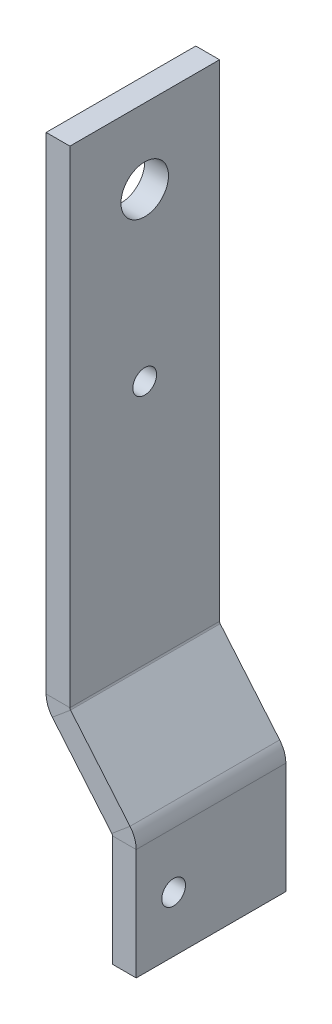
ISO-10303-21;
HEADER;
FILE_DESCRIPTION(('STEP AP214'),'2;1');
FILE_NAME('part.step','',(''),(''),'','','');
FILE_SCHEMA(('AUTOMOTIVE_DESIGN { 1 0 10303 214 1 1 1 1 }'));
ENDSEC;
DATA;
#1=APPLICATION_CONTEXT('core data for automotive mechanical design processes');
#2=APPLICATION_PROTOCOL_DEFINITION('international standard','automotive_design',2000,#1);
#3=PRODUCT_CONTEXT('',#1,'mechanical');
#4=PRODUCT('Part','Part','',(#3));
#5=PRODUCT_RELATED_PRODUCT_CATEGORY('part','',(#4));
#6=PRODUCT_DEFINITION_FORMATION('','',#4);
#7=PRODUCT_DEFINITION_CONTEXT('part definition',#1,'design');
#8=PRODUCT_DEFINITION('design','',#6,#7);
#9=PRODUCT_DEFINITION_SHAPE('','',#8);
#10=(LENGTH_UNIT() NAMED_UNIT(*) SI_UNIT(.MILLI.,.METRE.));
#11=(NAMED_UNIT(*) PLANE_ANGLE_UNIT() SI_UNIT($,.RADIAN.));
#12=(NAMED_UNIT(*) SI_UNIT($,.STERADIAN.) SOLID_ANGLE_UNIT());
#13=UNCERTAINTY_MEASURE_WITH_UNIT(LENGTH_MEASURE(1.E-05),#10,'distance_accuracy_value','');
#14=(GEOMETRIC_REPRESENTATION_CONTEXT(3) GLOBAL_UNCERTAINTY_ASSIGNED_CONTEXT((#13)) GLOBAL_UNIT_ASSIGNED_CONTEXT((#10,
#11,#12)) REPRESENTATION_CONTEXT('',''));
#15=CARTESIAN_POINT('',(0.,0.,0.));
#16=DIRECTION('',(0.,0.,1.));
#17=DIRECTION('',(1.,0.,0.));
#18=AXIS2_PLACEMENT_3D('',#15,#16,#17);
#19=CARTESIAN_POINT('',(-6.35,-130.,0.));
#20=DIRECTION('',(0.,0.,1.));
#21=DIRECTION('',(1.,0.,0.));
#22=AXIS2_PLACEMENT_3D('',#19,#20,#21);
#23=PLANE('',#22);
#24=DIRECTION('',(0.,-1.,0.));
#25=VECTOR('',#24,1.);
#26=CARTESIAN_POINT('',(0.,-130.,0.));
#27=LINE('',#26,#25);
#28=CARTESIAN_POINT('',(0.,0.,0.));
#29=VERTEX_POINT('',#28);
#30=CARTESIAN_POINT('',(0.,-130.,0.));
#31=VERTEX_POINT('',#30);
#32=EDGE_CURVE('E284',#29,#31,#27,.T.);
#33=ORIENTED_EDGE('',*,*,#32,.F.);
#34=DIRECTION('',(1.,0.,0.));
#35=VECTOR('',#34,1.);
#36=CARTESIAN_POINT('',(-6.35,0.,0.));
#37=LINE('',#36,#35);
#38=CARTESIAN_POINT('',(-6.35,0.,0.));
#39=VERTEX_POINT('',#38);
#40=EDGE_CURVE('E13',#39,#29,#37,.T.);
#41=ORIENTED_EDGE('',*,*,#40,.F.);
#42=DIRECTION('',(0.,-1.,0.));
#43=VECTOR('',#42,1.);
#44=CARTESIAN_POINT('',(-6.35,-130.,0.));
#45=LINE('',#44,#43);
#46=CARTESIAN_POINT('',(-6.35,-130.,0.));
#47=VERTEX_POINT('',#46);
#48=EDGE_CURVE('E287',#39,#47,#45,.T.);
#49=ORIENTED_EDGE('',*,*,#48,.T.);
#50=DIRECTION('',(1.,0.,0.));
#51=VECTOR('',#50,1.);
#52=CARTESIAN_POINT('',(-6.35,-130.,0.));
#53=LINE('',#52,#51);
#54=EDGE_CURVE('E86',#47,#31,#53,.T.);
#55=ORIENTED_EDGE('',*,*,#54,.T.);
#56=EDGE_LOOP('',(#33,#41,#49,#55));
#57=FACE_BOUND('',#56,.T.);
#58=ADVANCED_FACE('F83',(#57),#23,.T.);
#59=CARTESIAN_POINT('',(-6.35,0.,0.));
#60=DIRECTION('',(0.,1.,0.));
#61=DIRECTION('',(0.,0.,1.));
#62=AXIS2_PLACEMENT_3D('',#59,#60,#61);
#63=PLANE('',#62);
#64=DIRECTION('',(0.,0.,1.));
#65=VECTOR('',#64,1.);
#66=CARTESIAN_POINT('',(0.,0.,0.));
#67=LINE('',#66,#65);
#68=CARTESIAN_POINT('',(0.,0.,-40.));
#69=VERTEX_POINT('',#68);
#70=EDGE_CURVE('E289',#69,#29,#67,.T.);
#71=ORIENTED_EDGE('',*,*,#70,.F.);
#72=DIRECTION('',(1.,0.,0.));
#73=VECTOR('',#72,1.);
#74=CARTESIAN_POINT('',(-6.35,0.,-40.));
#75=LINE('',#74,#73);
#76=CARTESIAN_POINT('',(-6.35,0.,-40.));
#77=VERTEX_POINT('',#76);
#78=EDGE_CURVE('E92',#77,#69,#75,.T.);
#79=ORIENTED_EDGE('',*,*,#78,.F.);
#80=DIRECTION('',(0.,0.,1.));
#81=VECTOR('',#80,1.);
#82=CARTESIAN_POINT('',(-6.35,0.,0.));
#83=LINE('',#82,#81);
#84=EDGE_CURVE('E293',#77,#39,#83,.T.);
#85=ORIENTED_EDGE('',*,*,#84,.T.);
#86=ORIENTED_EDGE('',*,*,#40,.T.);
#87=EDGE_LOOP('',(#71,#79,#85,#86));
#88=FACE_BOUND('',#87,.T.);
#89=ADVANCED_FACE('F368',(#88),#63,.T.);
#90=CARTESIAN_POINT('',(-6.35,0.,-40.));
#91=DIRECTION('',(0.,0.,-1.));
#92=DIRECTION('',(0.,1.,0.));
#93=AXIS2_PLACEMENT_3D('',#90,#91,#92);
#94=PLANE('',#93);
#95=DIRECTION('',(0.,1.,0.));
#96=VECTOR('',#95,1.);
#97=CARTESIAN_POINT('',(0.,0.,-40.));
#98=LINE('',#97,#96);
#99=CARTESIAN_POINT('',(0.,-130.,-40.));
#100=VERTEX_POINT('',#99);
#101=EDGE_CURVE('E300',#100,#69,#98,.T.);
#102=ORIENTED_EDGE('',*,*,#101,.F.);
#103=DIRECTION('',(1.,0.,0.));
#104=VECTOR('',#103,1.);
#105=CARTESIAN_POINT('',(-6.35,-130.,-40.));
#106=LINE('',#105,#104);
#107=CARTESIAN_POINT('',(-6.35,-130.,-40.));
#108=VERTEX_POINT('',#107);
#109=EDGE_CURVE('E304',#108,#100,#106,.T.);
#110=ORIENTED_EDGE('',*,*,#109,.F.);
#111=DIRECTION('',(0.,1.,0.));
#112=VECTOR('',#111,1.);
#113=CARTESIAN_POINT('',(-6.35,0.,-40.));
#114=LINE('',#113,#112);
#115=EDGE_CURVE('E291',#108,#77,#114,.T.);
#116=ORIENTED_EDGE('',*,*,#115,.T.);
#117=ORIENTED_EDGE('',*,*,#78,.T.);
#118=EDGE_LOOP('',(#102,#110,#116,#117));
#119=FACE_BOUND('',#118,.T.);
#120=ADVANCED_FACE('F372',(#119),#94,.T.);
#121=CARTESIAN_POINT('',(-6.35,0.,0.));
#122=DIRECTION('',(-1.,0.,0.));
#123=DIRECTION('',(0.,0.,1.));
#124=AXIS2_PLACEMENT_3D('',#121,#122,#123);
#125=PLANE('',#124);
#126=CARTESIAN_POINT('',(-6.35,-64.45,-20.));
#127=DIRECTION('',(1.,0.,0.));
#128=DIRECTION('',(0.,0.,-1.));
#129=AXIS2_PLACEMENT_3D('',#126,#127,#128);
#130=CIRCLE('',#129,3.175);
#131=CARTESIAN_POINT('',(-6.35,-64.45,-23.175));
#132=VERTEX_POINT('',#131);
#133=EDGE_CURVE('E275',#132,#132,#130,.T.);
#134=ORIENTED_EDGE('',*,*,#133,.T.);
#135=EDGE_LOOP('',(#134));
#136=FACE_BOUND('',#135,.T.);
#137=CARTESIAN_POINT('',(-6.35,-20.,-20.));
#138=DIRECTION('',(1.,0.,0.));
#139=DIRECTION('',(0.,0.,-1.));
#140=AXIS2_PLACEMENT_3D('',#137,#138,#139);
#141=CIRCLE('',#140,6.35);
#142=CARTESIAN_POINT('',(-6.35,-20.,-26.35));
#143=VERTEX_POINT('',#142);
#144=EDGE_CURVE('E281',#143,#143,#141,.T.);
#145=ORIENTED_EDGE('',*,*,#144,.T.);
#146=EDGE_LOOP('',(#145));
#147=FACE_BOUND('',#146,.T.);
#148=ORIENTED_EDGE('',*,*,#48,.F.);
#149=ORIENTED_EDGE('',*,*,#84,.F.);
#150=ORIENTED_EDGE('',*,*,#115,.F.);
#151=DIRECTION('',(0.,0.,-1.));
#152=VECTOR('',#151,1.);
#153=CARTESIAN_POINT('',(-6.35,-130.,-40.));
#154=LINE('',#153,#152);
#155=EDGE_CURVE('E124',#47,#108,#154,.T.);
#156=ORIENTED_EDGE('',*,*,#155,.F.);
#157=EDGE_LOOP('',(#148,#149,#150,#156));
#158=FACE_BOUND('',#157,.T.);
#159=ADVANCED_FACE('F377',(#136,#147,#158),#125,.T.);
#160=CARTESIAN_POINT('',(0.,0.,0.));
#161=DIRECTION('',(-1.,0.,0.));
#162=DIRECTION('',(0.,0.,1.));
#163=AXIS2_PLACEMENT_3D('',#160,#161,#162);
#164=PLANE('',#163);
#165=CARTESIAN_POINT('',(0.,-64.45,-20.));
#166=DIRECTION('',(1.,0.,0.));
#167=DIRECTION('',(0.,0.,-1.));
#168=AXIS2_PLACEMENT_3D('',#165,#166,#167);
#169=CIRCLE('',#168,3.175);
#170=CARTESIAN_POINT('',(0.,-64.45,-23.175));
#171=VERTEX_POINT('',#170);
#172=EDGE_CURVE('E266',#171,#171,#169,.T.);
#173=ORIENTED_EDGE('',*,*,#172,.F.);
#174=EDGE_LOOP('',(#173));
#175=FACE_BOUND('',#174,.T.);
#176=CARTESIAN_POINT('',(0.,-20.,-20.));
#177=DIRECTION('',(1.,0.,0.));
#178=DIRECTION('',(0.,0.,-1.));
#179=AXIS2_PLACEMENT_3D('',#176,#177,#178);
#180=CIRCLE('',#179,6.35);
#181=CARTESIAN_POINT('',(0.,-20.,-26.35));
#182=VERTEX_POINT('',#181);
#183=EDGE_CURVE('E278',#182,#182,#180,.T.);
#184=ORIENTED_EDGE('',*,*,#183,.F.);
#185=EDGE_LOOP('',(#184));
#186=FACE_BOUND('',#185,.T.);
#187=ORIENTED_EDGE('',*,*,#32,.T.);
#188=DIRECTION('',(0.,0.,-1.));
#189=VECTOR('',#188,1.);
#190=CARTESIAN_POINT('',(0.,-130.,-40.));
#191=LINE('',#190,#189);
#192=EDGE_CURVE('E297',#31,#100,#191,.T.);
#193=ORIENTED_EDGE('',*,*,#192,.T.);
#194=ORIENTED_EDGE('',*,*,#101,.T.);
#195=ORIENTED_EDGE('',*,*,#70,.T.);
#196=EDGE_LOOP('',(#187,#193,#194,#195));
#197=FACE_BOUND('',#196,.T.);
#198=ADVANCED_FACE('F315',(#175,#186,#197),#164,.F.);
#199=CARTESIAN_POINT('',(-6.35,-20.,-20.));
#200=DIRECTION('',(1.,0.,0.));
#201=DIRECTION('',(0.,0.,-1.));
#202=AXIS2_PLACEMENT_3D('',#199,#200,#201);
#203=CYLINDRICAL_SURFACE('',#202,6.35);
#204=ORIENTED_EDGE('',*,*,#144,.F.);
#205=EDGE_LOOP('',(#204));
#206=FACE_BOUND('',#205,.T.);
#207=ORIENTED_EDGE('',*,*,#183,.T.);
#208=EDGE_LOOP('',(#207));
#209=FACE_BOUND('',#208,.T.);
#210=ADVANCED_FACE('F381',(#206,#209),#203,.F.);
#211=CARTESIAN_POINT('',(-6.35,-64.45,-20.));
#212=DIRECTION('',(1.,0.,0.));
#213=DIRECTION('',(0.,0.,-1.));
#214=AXIS2_PLACEMENT_3D('',#211,#212,#213);
#215=CYLINDRICAL_SURFACE('',#214,3.175);
#216=ORIENTED_EDGE('',*,*,#133,.F.);
#217=EDGE_LOOP('',(#216));
#218=FACE_BOUND('',#217,.T.);
#219=ORIENTED_EDGE('',*,*,#172,.T.);
#220=EDGE_LOOP('',(#219));
#221=FACE_BOUND('',#220,.T.);
#222=ADVANCED_FACE('F388',(#218,#221),#215,.F.);
#223=CARTESIAN_POINT('',(0.736600000000022,-130.,0.));
#224=DIRECTION('',(0.,0.,1.));
#225=DIRECTION('',(1.,0.,0.));
#226=AXIS2_PLACEMENT_3D('',#223,#224,#225);
#227=PLANE('',#226);
#228=DIRECTION('',(0.766044443118982,0.642787609686535,0.));
#229=VECTOR('',#228,1.);
#230=CARTESIAN_POINT('',(-4.69205055060698,-134.555178674805,0.));
#231=LINE('',#230,#229);
#232=CARTESIAN_POINT('',(0.172331663198564,-130.473477353295,0.));
#233=VERTEX_POINT('',#232);
#234=CARTESIAN_POINT('',(-4.69205055060696,-134.555178674805,0.));
#235=VERTEX_POINT('',#234);
#236=EDGE_CURVE('E222',#233,#235,#231,.F.);
#237=ORIENTED_EDGE('',*,*,#236,.F.);
#238=CARTESIAN_POINT('',(0.736600000000022,-130.,0.));
#239=DIRECTION('',(0.,0.,-1.));
#240=DIRECTION('',(-1.,0.,0.));
#241=AXIS2_PLACEMENT_3D('',#238,#239,#240);
#242=CIRCLE('',#241,0.73660000000002);
#243=EDGE_CURVE('E270',#31,#233,#242,.F.);
#244=ORIENTED_EDGE('',*,*,#243,.F.);
#245=ORIENTED_EDGE('',*,*,#54,.F.);
#246=CARTESIAN_POINT('',(0.736600000000022,-130.,0.));
#247=DIRECTION('',(0.,0.,-1.));
#248=DIRECTION('',(-1.,0.,0.));
#249=AXIS2_PLACEMENT_3D('',#246,#247,#248);
#250=CIRCLE('',#249,7.08660000000002);
#251=EDGE_CURVE('E263',#47,#235,#250,.F.);
#252=ORIENTED_EDGE('',*,*,#251,.T.);
#253=EDGE_LOOP('',(#237,#244,#245,#252));
#254=FACE_BOUND('',#253,.T.);
#255=ADVANCED_FACE('F319',(#254),#227,.T.);
#256=CARTESIAN_POINT('',(0.736600000000022,-130.,-40.));
#257=DIRECTION('',(0.,0.,1.));
#258=DIRECTION('',(1.,0.,0.));
#259=AXIS2_PLACEMENT_3D('',#256,#257,#258);
#260=PLANE('',#259);
#261=CARTESIAN_POINT('',(0.736600000000022,-130.,-40.));
#262=DIRECTION('',(0.,0.,-1.));
#263=DIRECTION('',(-1.,0.,0.));
#264=AXIS2_PLACEMENT_3D('',#261,#262,#263);
#265=CIRCLE('',#264,0.73660000000002);
#266=CARTESIAN_POINT('',(0.172331663198564,-130.473477353295,-40.));
#267=VERTEX_POINT('',#266);
#268=EDGE_CURVE('E235',#267,#100,#265,.T.);
#269=ORIENTED_EDGE('',*,*,#268,.F.);
#270=DIRECTION('',(0.766044443118982,0.642787609686535,0.));
#271=VECTOR('',#270,1.);
#272=CARTESIAN_POINT('',(0.172331663198563,-130.473477353295,-40.));
#273=LINE('',#272,#271);
#274=CARTESIAN_POINT('',(-4.69205055060697,-134.555178674805,-40.));
#275=VERTEX_POINT('',#274);
#276=EDGE_CURVE('E256',#267,#275,#273,.F.);
#277=ORIENTED_EDGE('',*,*,#276,.T.);
#278=CARTESIAN_POINT('',(0.736600000000022,-130.,-40.));
#279=DIRECTION('',(0.,0.,-1.));
#280=DIRECTION('',(-1.,0.,0.));
#281=AXIS2_PLACEMENT_3D('',#278,#279,#280);
#282=CIRCLE('',#281,7.08660000000002);
#283=EDGE_CURVE('E267',#275,#108,#282,.T.);
#284=ORIENTED_EDGE('',*,*,#283,.T.);
#285=ORIENTED_EDGE('',*,*,#109,.T.);
#286=EDGE_LOOP('',(#269,#277,#284,#285));
#287=FACE_BOUND('',#286,.T.);
#288=ADVANCED_FACE('F393',(#287),#260,.F.);
#289=CARTESIAN_POINT('',(0.736600000000022,-130.,-40.));
#290=DIRECTION('',(0.,0.,-1.));
#291=DIRECTION('',(-0.766044443118982,-0.642787609686535,0.));
#292=AXIS2_PLACEMENT_3D('',#289,#290,#291);
#293=CYLINDRICAL_SURFACE('',#292,7.08660000000002);
#294=ORIENTED_EDGE('',*,*,#155,.T.);
#295=ORIENTED_EDGE('',*,*,#283,.F.);
#296=DIRECTION('',(0.,0.,-1.));
#297=VECTOR('',#296,1.);
#298=CARTESIAN_POINT('',(-4.69205055060697,-134.555178674805,0.));
#299=LINE('',#298,#297);
#300=EDGE_CURVE('E254',#275,#235,#299,.F.);
#301=ORIENTED_EDGE('',*,*,#300,.T.);
#302=ORIENTED_EDGE('',*,*,#251,.F.);
#303=EDGE_LOOP('',(#294,#295,#301,#302));
#304=FACE_BOUND('',#303,.T.);
#305=ADVANCED_FACE('F396',(#304),#293,.T.);
#306=CARTESIAN_POINT('',(0.736600000000022,-130.,-40.));
#307=DIRECTION('',(0.,0.,-1.));
#308=DIRECTION('',(-0.766044443118982,-0.642787609686535,0.));
#309=AXIS2_PLACEMENT_3D('',#306,#307,#308);
#310=CYLINDRICAL_SURFACE('',#309,0.73660000000002);
#311=ORIENTED_EDGE('',*,*,#192,.F.);
#312=ORIENTED_EDGE('',*,*,#243,.T.);
#313=DIRECTION('',(0.,0.,-1.));
#314=VECTOR('',#313,1.);
#315=CARTESIAN_POINT('',(0.172331663198563,-130.473477353295,0.));
#316=LINE('',#315,#314);
#317=EDGE_CURVE('E259',#233,#267,#316,.T.);
#318=ORIENTED_EDGE('',*,*,#317,.T.);
#319=ORIENTED_EDGE('',*,*,#268,.T.);
#320=EDGE_LOOP('',(#311,#312,#318,#319));
#321=FACE_BOUND('',#320,.T.);
#322=ADVANCED_FACE('F317',(#321),#310,.F.);
#323=CARTESIAN_POINT('',(11.2053080283578,-153.500912874045,-40.));
#324=DIRECTION('',(0.,0.,1.));
#325=DIRECTION('',(0.,-1.,0.));
#326=AXIS2_PLACEMENT_3D('',#323,#324,#325);
#327=PLANE('',#326);
#328=ORIENTED_EDGE('',*,*,#276,.F.);
#329=DIRECTION('',(-0.642787609686535,0.766044443118982,0.));
#330=VECTOR('',#329,1.);
#331=CARTESIAN_POINT('',(16.0696902421634,-149.419211552535,-40.));
#332=LINE('',#331,#330);
#333=CARTESIAN_POINT('',(16.0696902421634,-149.419211552535,-40.));
#334=VERTEX_POINT('',#333);
#335=EDGE_CURVE('E252',#267,#334,#332,.F.);
#336=ORIENTED_EDGE('',*,*,#335,.T.);
#337=DIRECTION('',(0.766044443118982,0.642787609686535,0.));
#338=VECTOR('',#337,1.);
#339=CARTESIAN_POINT('',(11.2053080283578,-153.500912874045,-40.));
#340=LINE('',#339,#338);
#341=CARTESIAN_POINT('',(11.2053080283579,-153.500912874045,-40.));
#342=VERTEX_POINT('',#341);
#343=EDGE_CURVE('E232',#342,#334,#340,.T.);
#344=ORIENTED_EDGE('',*,*,#343,.F.);
#345=DIRECTION('',(0.642787609686535,-0.766044443118982,0.));
#346=VECTOR('',#345,1.);
#347=CARTESIAN_POINT('',(-68.8768861595989,-58.0626702477188,-40.0000000000001));
#348=LINE('',#347,#346);
#349=EDGE_CURVE('E244',#275,#342,#348,.T.);
#350=ORIENTED_EDGE('',*,*,#349,.F.);
#351=EDGE_LOOP('',(#328,#336,#344,#350));
#352=FACE_BOUND('',#351,.T.);
#353=ADVANCED_FACE('F401',(#352),#327,.F.);
#354=CARTESIAN_POINT('',(-4.86438221380553,-134.34980179607,0.));
#355=DIRECTION('',(0.,0.,-1.));
#356=DIRECTION('',(0.,1.,0.));
#357=AXIS2_PLACEMENT_3D('',#354,#355,#356);
#358=PLANE('',#357);
#359=ORIENTED_EDGE('',*,*,#236,.T.);
#360=DIRECTION('',(-0.642787609686535,0.766044443118982,0.));
#361=VECTOR('',#360,1.);
#362=CARTESIAN_POINT('',(-68.8768861595989,-58.0626702477188,0.));
#363=LINE('',#362,#361);
#364=CARTESIAN_POINT('',(11.2053080283579,-153.500912874045,0.));
#365=VERTEX_POINT('',#364);
#366=EDGE_CURVE('E239',#365,#235,#363,.T.);
#367=ORIENTED_EDGE('',*,*,#366,.F.);
#368=DIRECTION('',(0.766044443118982,0.642787609686535,0.));
#369=VECTOR('',#368,1.);
#370=CARTESIAN_POINT('',(11.2053080283578,-153.500912874045,0.));
#371=LINE('',#370,#369);
#372=CARTESIAN_POINT('',(16.0696902421634,-149.419211552535,0.));
#373=VERTEX_POINT('',#372);
#374=EDGE_CURVE('E236',#365,#373,#371,.T.);
#375=ORIENTED_EDGE('',*,*,#374,.T.);
#376=DIRECTION('',(0.642787609686535,-0.766044443118982,0.));
#377=VECTOR('',#376,1.);
#378=CARTESIAN_POINT('',(0.,-130.26810047456,0.));
#379=LINE('',#378,#377);
#380=EDGE_CURVE('E246',#373,#233,#379,.F.);
#381=ORIENTED_EDGE('',*,*,#380,.T.);
#382=EDGE_LOOP('',(#359,#367,#375,#381));
#383=FACE_BOUND('',#382,.T.);
#384=ADVANCED_FACE('F322',(#383),#358,.F.);
#385=CARTESIAN_POINT('',(-68.8768861595989,-58.0626702477188,0.));
#386=DIRECTION('',(0.766044443118982,0.642787609686535,0.));
#387=DIRECTION('',(-0.642787609686535,0.766044443118982,0.));
#388=AXIS2_PLACEMENT_3D('',#385,#386,#387);
#389=PLANE('',#388);
#390=ORIENTED_EDGE('',*,*,#300,.F.);
#391=ORIENTED_EDGE('',*,*,#349,.T.);
#392=DIRECTION('',(0.,0.,1.));
#393=VECTOR('',#392,1.);
#394=CARTESIAN_POINT('',(11.2053080283579,-153.500912874045,0.));
#395=LINE('',#394,#393);
#396=EDGE_CURVE('E242',#342,#365,#395,.T.);
#397=ORIENTED_EDGE('',*,*,#396,.T.);
#398=ORIENTED_EDGE('',*,*,#366,.T.);
#399=EDGE_LOOP('',(#390,#391,#397,#398));
#400=FACE_BOUND('',#399,.T.);
#401=ADVANCED_FACE('F326',(#400),#389,.F.);
#402=CARTESIAN_POINT('',(-64.0125039457934,-53.9809689262093,0.));
#403=DIRECTION('',(0.766044443118982,0.642787609686535,0.));
#404=DIRECTION('',(-0.642787609686535,0.766044443118982,0.));
#405=AXIS2_PLACEMENT_3D('',#402,#403,#404);
#406=PLANE('',#405);
#407=ORIENTED_EDGE('',*,*,#335,.F.);
#408=ORIENTED_EDGE('',*,*,#317,.F.);
#409=ORIENTED_EDGE('',*,*,#380,.F.);
#410=DIRECTION('',(0.,0.,-1.));
#411=VECTOR('',#410,1.);
#412=CARTESIAN_POINT('',(16.0696902421634,-149.419211552535,0.));
#413=LINE('',#412,#411);
#414=EDGE_CURVE('E249',#334,#373,#413,.F.);
#415=ORIENTED_EDGE('',*,*,#414,.F.);
#416=EDGE_LOOP('',(#407,#408,#409,#415));
#417=FACE_BOUND('',#416,.T.);
#418=ADVANCED_FACE('F410',(#417),#406,.T.);
#419=CARTESIAN_POINT('',(10.6410396915564,-153.97439022734,-40.));
#420=DIRECTION('',(0.,0.,-1.));
#421=DIRECTION('',(-1.,0.,0.));
#422=AXIS2_PLACEMENT_3D('',#419,#420,#421);
#423=PLANE('',#422);
#424=DIRECTION('',(-1.,0.,0.));
#425=VECTOR('',#424,1.);
#426=CARTESIAN_POINT('',(17.7276396915564,-153.97439022734,-40.));
#427=LINE('',#426,#425);
#428=CARTESIAN_POINT('',(11.3776396915564,-153.97439022734,-40.));
#429=VERTEX_POINT('',#428);
#430=CARTESIAN_POINT('',(17.7276396915564,-153.97439022734,-40.));
#431=VERTEX_POINT('',#430);
#432=EDGE_CURVE('E201',#429,#431,#427,.F.);
#433=ORIENTED_EDGE('',*,*,#432,.F.);
#434=CARTESIAN_POINT('',(10.6410396915564,-153.97439022734,-40.));
#435=DIRECTION('',(0.,0.,1.));
#436=DIRECTION('',(1.,0.,0.));
#437=AXIS2_PLACEMENT_3D('',#434,#435,#436);
#438=CIRCLE('',#437,0.736599999999987);
#439=EDGE_CURVE('E226',#342,#429,#438,.F.);
#440=ORIENTED_EDGE('',*,*,#439,.F.);
#441=ORIENTED_EDGE('',*,*,#343,.T.);
#442=CARTESIAN_POINT('',(10.6410396915564,-153.97439022734,-40.));
#443=DIRECTION('',(0.,0.,1.));
#444=DIRECTION('',(1.,0.,0.));
#445=AXIS2_PLACEMENT_3D('',#442,#443,#444);
#446=CIRCLE('',#445,7.08659999999999);
#447=EDGE_CURVE('E219',#334,#431,#446,.F.);
#448=ORIENTED_EDGE('',*,*,#447,.T.);
#449=EDGE_LOOP('',(#433,#440,#441,#448));
#450=FACE_BOUND('',#449,.T.);
#451=ADVANCED_FACE('F336',(#450),#423,.T.);
#452=CARTESIAN_POINT('',(10.6410396915564,-153.97439022734,0.));
#453=DIRECTION('',(0.,0.,-1.));
#454=DIRECTION('',(-1.,0.,0.));
#455=AXIS2_PLACEMENT_3D('',#452,#453,#454);
#456=PLANE('',#455);
#457=CARTESIAN_POINT('',(10.6410396915564,-153.97439022734,0.));
#458=DIRECTION('',(0.,0.,1.));
#459=DIRECTION('',(1.,0.,0.));
#460=AXIS2_PLACEMENT_3D('',#457,#458,#459);
#461=CIRCLE('',#460,0.736599999999987);
#462=CARTESIAN_POINT('',(11.3776396915564,-153.97439022734,0.));
#463=VERTEX_POINT('',#462);
#464=EDGE_CURVE('E229',#463,#365,#461,.T.);
#465=ORIENTED_EDGE('',*,*,#464,.F.);
#466=DIRECTION('',(-1.,0.,0.));
#467=VECTOR('',#466,1.);
#468=CARTESIAN_POINT('',(11.3776396915564,-153.97439022734,0.));
#469=LINE('',#468,#467);
#470=CARTESIAN_POINT('',(17.7276396915564,-153.97439022734,0.));
#471=VERTEX_POINT('',#470);
#472=EDGE_CURVE('E212',#463,#471,#469,.F.);
#473=ORIENTED_EDGE('',*,*,#472,.T.);
#474=CARTESIAN_POINT('',(10.6410396915564,-153.97439022734,0.));
#475=DIRECTION('',(0.,0.,1.));
#476=DIRECTION('',(1.,0.,0.));
#477=AXIS2_PLACEMENT_3D('',#474,#475,#476);
#478=CIRCLE('',#477,7.08659999999999);
#479=EDGE_CURVE('E223',#471,#373,#478,.T.);
#480=ORIENTED_EDGE('',*,*,#479,.T.);
#481=ORIENTED_EDGE('',*,*,#374,.F.);
#482=EDGE_LOOP('',(#465,#473,#480,#481));
#483=FACE_BOUND('',#482,.T.);
#484=ADVANCED_FACE('F416',(#483),#456,.F.);
#485=CARTESIAN_POINT('',(10.6410396915564,-153.97439022734,0.));
#486=DIRECTION('',(0.,0.,1.));
#487=DIRECTION('',(1.,0.,0.));
#488=AXIS2_PLACEMENT_3D('',#485,#486,#487);
#489=CYLINDRICAL_SURFACE('',#488,7.08659999999999);
#490=ORIENTED_EDGE('',*,*,#414,.T.);
#491=ORIENTED_EDGE('',*,*,#479,.F.);
#492=DIRECTION('',(0.,0.,1.));
#493=VECTOR('',#492,1.);
#494=CARTESIAN_POINT('',(17.7276396915564,-153.97439022734,-40.));
#495=LINE('',#494,#493);
#496=EDGE_CURVE('E210',#471,#431,#495,.F.);
#497=ORIENTED_EDGE('',*,*,#496,.T.);
#498=ORIENTED_EDGE('',*,*,#447,.F.);
#499=EDGE_LOOP('',(#490,#491,#497,#498));
#500=FACE_BOUND('',#499,.T.);
#501=ADVANCED_FACE('F339',(#500),#489,.T.);
#502=CARTESIAN_POINT('',(10.6410396915564,-153.97439022734,0.));
#503=DIRECTION('',(0.,0.,1.));
#504=DIRECTION('',(1.,0.,0.));
#505=AXIS2_PLACEMENT_3D('',#502,#503,#504);
#506=CYLINDRICAL_SURFACE('',#505,0.736599999999987);
#507=ORIENTED_EDGE('',*,*,#396,.F.);
#508=ORIENTED_EDGE('',*,*,#439,.T.);
#509=DIRECTION('',(0.,0.,1.));
#510=VECTOR('',#509,1.);
#511=CARTESIAN_POINT('',(11.3776396915564,-153.97439022734,-40.));
#512=LINE('',#511,#510);
#513=EDGE_CURVE('E215',#429,#463,#512,.T.);
#514=ORIENTED_EDGE('',*,*,#513,.T.);
#515=ORIENTED_EDGE('',*,*,#464,.T.);
#516=EDGE_LOOP('',(#507,#508,#514,#515));
#517=FACE_BOUND('',#516,.T.);
#518=ADVANCED_FACE('F332',(#517),#506,.F.);
#519=CARTESIAN_POINT('',(17.7276396915564,-153.706289752779,-40.));
#520=DIRECTION('',(0.,0.,1.));
#521=DIRECTION('',(1.,0.,0.));
#522=AXIS2_PLACEMENT_3D('',#519,#520,#521);
#523=PLANE('',#522);
#524=ORIENTED_EDGE('',*,*,#432,.T.);
#525=DIRECTION('',(0.,1.,0.));
#526=VECTOR('',#525,1.);
#527=CARTESIAN_POINT('',(17.7276396915564,-0.205376878734619,-40.));
#528=LINE('',#527,#526);
#529=CARTESIAN_POINT('',(17.7276396915564,-183.706289752779,-40.));
#530=VERTEX_POINT('',#529);
#531=EDGE_CURVE('E182',#530,#431,#528,.T.);
#532=ORIENTED_EDGE('',*,*,#531,.F.);
#533=DIRECTION('',(-1.,0.,0.));
#534=VECTOR('',#533,1.);
#535=CARTESIAN_POINT('',(17.7276396915564,-183.706289752779,-40.));
#536=LINE('',#535,#534);
#537=CARTESIAN_POINT('',(11.3776396915564,-183.706289752779,-40.));
#538=VERTEX_POINT('',#537);
#539=EDGE_CURVE('E188',#530,#538,#536,.T.);
#540=ORIENTED_EDGE('',*,*,#539,.T.);
#541=DIRECTION('',(0.,-1.,0.));
#542=VECTOR('',#541,1.);
#543=CARTESIAN_POINT('',(11.3776396915564,-153.706289752779,-40.));
#544=LINE('',#543,#542);
#545=EDGE_CURVE('E208',#538,#429,#544,.F.);
#546=ORIENTED_EDGE('',*,*,#545,.T.);
#547=EDGE_LOOP('',(#524,#532,#540,#546));
#548=FACE_BOUND('',#547,.T.);
#549=ADVANCED_FACE('F200',(#548),#523,.F.);
#550=CARTESIAN_POINT('',(17.7276396915564,-183.706289752779,0.));
#551=DIRECTION('',(0.,0.,-1.));
#552=DIRECTION('',(-1.,0.,0.));
#553=AXIS2_PLACEMENT_3D('',#550,#551,#552);
#554=PLANE('',#553);
#555=ORIENTED_EDGE('',*,*,#472,.F.);
#556=DIRECTION('',(0.,1.,0.));
#557=VECTOR('',#556,1.);
#558=CARTESIAN_POINT('',(11.3776396915564,-183.706289752779,0.));
#559=LINE('',#558,#557);
#560=CARTESIAN_POINT('',(11.3776396915564,-183.706289752779,0.));
#561=VERTEX_POINT('',#560);
#562=EDGE_CURVE('E204',#463,#561,#559,.F.);
#563=ORIENTED_EDGE('',*,*,#562,.T.);
#564=DIRECTION('',(-1.,0.,0.));
#565=VECTOR('',#564,1.);
#566=CARTESIAN_POINT('',(17.7276396915564,-183.706289752779,0.));
#567=LINE('',#566,#565);
#568=CARTESIAN_POINT('',(17.7276396915564,-183.706289752779,0.));
#569=VERTEX_POINT('',#568);
#570=EDGE_CURVE('E197',#569,#561,#567,.T.);
#571=ORIENTED_EDGE('',*,*,#570,.F.);
#572=DIRECTION('',(0.,-1.,0.));
#573=VECTOR('',#572,1.);
#574=CARTESIAN_POINT('',(17.7276396915564,-0.205376878734619,0.));
#575=LINE('',#574,#573);
#576=EDGE_CURVE('E184',#471,#569,#575,.T.);
#577=ORIENTED_EDGE('',*,*,#576,.F.);
#578=EDGE_LOOP('',(#555,#563,#571,#577));
#579=FACE_BOUND('',#578,.T.);
#580=ADVANCED_FACE('F343',(#579),#554,.F.);
#581=CARTESIAN_POINT('',(17.7276396915564,-0.205376878734619,0.));
#582=DIRECTION('',(-1.,0.,0.));
#583=DIRECTION('',(0.,0.,1.));
#584=AXIS2_PLACEMENT_3D('',#581,#582,#583);
#585=PLANE('',#584);
#586=CARTESIAN_POINT('',(17.7276396915565,-168.840339990059,-10.));
#587=DIRECTION('',(1.,0.,0.));
#588=DIRECTION('',(0.,1.,0.));
#589=AXIS2_PLACEMENT_3D('',#586,#587,#588);
#590=CIRCLE('',#589,3.175);
#591=CARTESIAN_POINT('',(17.7276396915565,-165.665339990059,-10.));
#592=VERTEX_POINT('',#591);
#593=EDGE_CURVE('E349',#592,#592,#590,.T.);
#594=ORIENTED_EDGE('',*,*,#593,.F.);
#595=EDGE_LOOP('',(#594));
#596=FACE_BOUND('',#595,.T.);
#597=ORIENTED_EDGE('',*,*,#496,.F.);
#598=ORIENTED_EDGE('',*,*,#576,.T.);
#599=DIRECTION('',(0.,0.,-1.));
#600=VECTOR('',#599,1.);
#601=CARTESIAN_POINT('',(17.7276396915564,-183.706289752779,0.));
#602=LINE('',#601,#600);
#603=EDGE_CURVE('E177',#569,#530,#602,.T.);
#604=ORIENTED_EDGE('',*,*,#603,.T.);
#605=ORIENTED_EDGE('',*,*,#531,.T.);
#606=EDGE_LOOP('',(#597,#598,#604,#605));
#607=FACE_BOUND('',#606,.T.);
#608=ADVANCED_FACE('F180',(#596,#607),#585,.F.);
#609=CARTESIAN_POINT('',(11.3776396915564,-0.205376878734619,0.));
#610=DIRECTION('',(-1.,0.,0.));
#611=DIRECTION('',(0.,0.,1.));
#612=AXIS2_PLACEMENT_3D('',#609,#610,#611);
#613=PLANE('',#612);
#614=CARTESIAN_POINT('',(11.3776396915564,-168.840339990059,-10.));
#615=DIRECTION('',(-1.,0.,0.));
#616=DIRECTION('',(0.,0.,1.));
#617=AXIS2_PLACEMENT_3D('',#614,#615,#616);
#618=CIRCLE('',#617,3.175);
#619=CARTESIAN_POINT('',(11.3776396915564,-168.840339990059,-6.82500000000001));
#620=VERTEX_POINT('',#619);
#621=EDGE_CURVE('E218',#620,#620,#618,.F.);
#622=ORIENTED_EDGE('',*,*,#621,.T.);
#623=EDGE_LOOP('',(#622));
#624=FACE_BOUND('',#623,.T.);
#625=ORIENTED_EDGE('',*,*,#562,.F.);
#626=ORIENTED_EDGE('',*,*,#513,.F.);
#627=ORIENTED_EDGE('',*,*,#545,.F.);
#628=DIRECTION('',(0.,0.,1.));
#629=VECTOR('',#628,1.);
#630=CARTESIAN_POINT('',(11.3776396915564,-183.706289752779,-40.));
#631=LINE('',#630,#629);
#632=EDGE_CURVE('E193',#561,#538,#631,.F.);
#633=ORIENTED_EDGE('',*,*,#632,.F.);
#634=EDGE_LOOP('',(#625,#626,#627,#633));
#635=FACE_BOUND('',#634,.T.);
#636=ADVANCED_FACE('F357',(#624,#635),#613,.T.);
#637=CARTESIAN_POINT('',(17.7276396915564,-183.706289752779,-40.));
#638=DIRECTION('',(0.,1.,0.));
#639=DIRECTION('',(0.,0.,1.));
#640=AXIS2_PLACEMENT_3D('',#637,#638,#639);
#641=PLANE('',#640);
#642=ORIENTED_EDGE('',*,*,#632,.T.);
#643=ORIENTED_EDGE('',*,*,#539,.F.);
#644=ORIENTED_EDGE('',*,*,#603,.F.);
#645=ORIENTED_EDGE('',*,*,#570,.T.);
#646=EDGE_LOOP('',(#642,#643,#644,#645));
#647=FACE_BOUND('',#646,.T.);
#648=ADVANCED_FACE('F191',(#647),#641,.F.);
#649=CARTESIAN_POINT('',(2.39738357048725,-168.840339990059,-10.));
#650=DIRECTION('',(1.,0.,0.));
#651=DIRECTION('',(0.,1.,0.));
#652=AXIS2_PLACEMENT_3D('',#649,#650,#651);
#653=CYLINDRICAL_SURFACE('',#652,3.175);
#654=ORIENTED_EDGE('',*,*,#593,.T.);
#655=EDGE_LOOP('',(#654));
#656=FACE_BOUND('',#655,.T.);
#657=ORIENTED_EDGE('',*,*,#621,.F.);
#658=EDGE_LOOP('',(#657));
#659=FACE_BOUND('',#658,.T.);
#660=ADVANCED_FACE('F353',(#656,#659),#653,.F.);
#661=CLOSED_SHELL('',(#58,#89,#120,#159,#198,#210,#222,#255,#288,#305,#322,#353,#384,#401,#418,
#451,#484,#501,#518,#549,#580,#608,#636,#648,#660));
#662=MANIFOLD_SOLID_BREP('B2',#661);
#663=ADVANCED_BREP_SHAPE_REPRESENTATION('',(#18,#662),#14);
#664=SHAPE_DEFINITION_REPRESENTATION(#9,#663);
ENDSEC;
END-ISO-10303-21;
